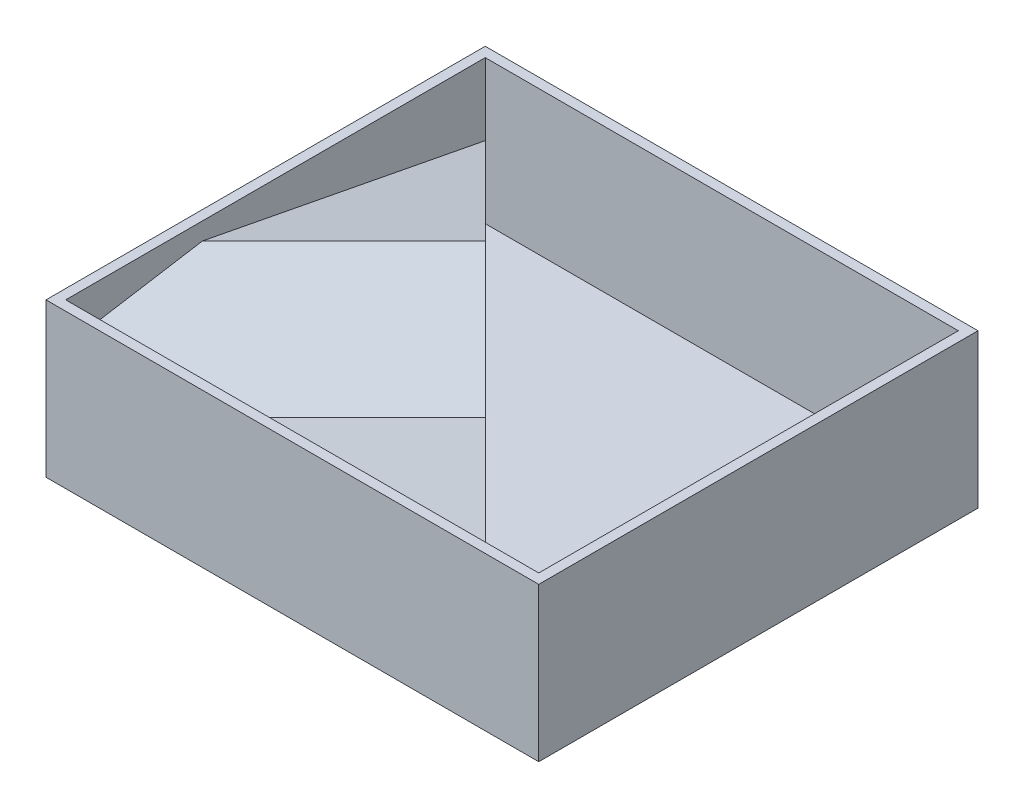
ISO-10303-21;
HEADER;
FILE_DESCRIPTION(('STEP AP214'),'2;1');
FILE_NAME('part.step','',(''),(''),'','','');
FILE_SCHEMA(('AUTOMOTIVE_DESIGN { 1 0 10303 214 1 1 1 1 }'));
ENDSEC;
DATA;
#1=APPLICATION_CONTEXT('core data for automotive mechanical design processes');
#2=APPLICATION_PROTOCOL_DEFINITION('international standard','automotive_design',2000,#1);
#3=PRODUCT_CONTEXT('',#1,'mechanical');
#4=PRODUCT('Part','Part','',(#3));
#5=PRODUCT_RELATED_PRODUCT_CATEGORY('part','',(#4));
#6=PRODUCT_DEFINITION_FORMATION('','',#4);
#7=PRODUCT_DEFINITION_CONTEXT('part definition',#1,'design');
#8=PRODUCT_DEFINITION('design','',#6,#7);
#9=PRODUCT_DEFINITION_SHAPE('','',#8);
#10=(LENGTH_UNIT() NAMED_UNIT(*) SI_UNIT(.MILLI.,.METRE.));
#11=(NAMED_UNIT(*) PLANE_ANGLE_UNIT() SI_UNIT($,.RADIAN.));
#12=(NAMED_UNIT(*) SI_UNIT($,.STERADIAN.) SOLID_ANGLE_UNIT());
#13=UNCERTAINTY_MEASURE_WITH_UNIT(LENGTH_MEASURE(1.E-05),#10,'distance_accuracy_value','');
#14=(GEOMETRIC_REPRESENTATION_CONTEXT(3) GLOBAL_UNCERTAINTY_ASSIGNED_CONTEXT((#13)) GLOBAL_UNIT_ASSIGNED_CONTEXT((#10,
#11,#12)) REPRESENTATION_CONTEXT('',''));
#15=CARTESIAN_POINT('',(0.,0.,0.));
#16=DIRECTION('',(0.,0.,1.));
#17=DIRECTION('',(1.,0.,0.));
#18=AXIS2_PLACEMENT_3D('',#15,#16,#17);
#19=CARTESIAN_POINT('',(-59.9378997860176,39.624,-63.9370439423789));
#20=DIRECTION('',(1.,0.,0.));
#21=DIRECTION('',(0.,0.,-1.));
#22=AXIS2_PLACEMENT_3D('',#19,#20,#21);
#23=PLANE('',#22);
#24=DIRECTION('',(0.,-1.,0.));
#25=VECTOR('',#24,1.);
#26=CARTESIAN_POINT('',(-59.9378997860176,39.624,-61.397043942379));
#27=LINE('',#26,#25);
#28=CARTESIAN_POINT('',(-59.9378997860176,18.4494482096416,-61.397043942379));
#29=VERTEX_POINT('',#28);
#30=CARTESIAN_POINT('',(-59.9378997860176,2.54,-61.397043942379));
#31=VERTEX_POINT('',#30);
#32=EDGE_CURVE('E212',#29,#31,#27,.T.);
#33=ORIENTED_EDGE('',*,*,#32,.F.);
#34=DIRECTION('',(0.,-0.189206076258095,-0.981937401623452));
#35=VECTOR('',#34,1.);
#36=CARTESIAN_POINT('',(-59.9378997860176,18.7355718555945,-59.9121259365388));
#37=LINE('',#36,#35);
#38=CARTESIAN_POINT('',(-59.9378997860176,32.514624018701,11.5980863434216));
#39=VERTEX_POINT('',#38);
#40=EDGE_CURVE('E11',#39,#29,#37,.T.);
#41=ORIENTED_EDGE('',*,*,#40,.F.);
#42=DIRECTION('',(0.,0.162584559288982,-0.986694613890644));
#43=VECTOR('',#42,1.);
#44=CARTESIAN_POINT('',(-59.9378997860176,44.8199958795938,-63.0808634299304));
#45=LINE('',#44,#43);
#46=CARTESIAN_POINT('',(-59.9378997860176,26.7132358306222,46.8056023787655));
#47=VERTEX_POINT('',#46);
#48=EDGE_CURVE('E188',#47,#39,#45,.T.);
#49=ORIENTED_EDGE('',*,*,#48,.F.);
#50=DIRECTION('',(0.,-1.,0.));
#51=VECTOR('',#50,1.);
#52=CARTESIAN_POINT('',(-59.9378997860176,39.624,46.8056023787655));
#53=LINE('',#52,#51);
#54=CARTESIAN_POINT('',(-59.9378997860176,2.54,46.8056023787655));
#55=VERTEX_POINT('',#54);
#56=EDGE_CURVE('E207',#47,#55,#53,.T.);
#57=ORIENTED_EDGE('',*,*,#56,.T.);
#58=DIRECTION('',(0.,0.,1.));
#59=VECTOR('',#58,1.);
#60=CARTESIAN_POINT('',(-59.9378997860176,2.54,-63.9370439423789));
#61=LINE('',#60,#59);
#62=EDGE_CURVE('E195',#31,#55,#61,.T.);
#63=ORIENTED_EDGE('',*,*,#62,.F.);
#64=EDGE_LOOP('',(#33,#41,#49,#57,#63));
#65=FACE_BOUND('',#64,.T.);
#66=ADVANCED_FACE('F43',(#65),#23,.T.);
#67=DIRECTION('',(0.,0.162584559288982,-0.986694613890644));
#68=VECTOR('',#67,1.);
#69=CARTESIAN_POINT('',(-59.9378997860176,47.3591083214804,-62.6624761482552));
#70=LINE('',#69,#68);
#71=CARTESIAN_POINT('',(-59.9378997860176,29.3212888655207,46.8056023787655));
#72=VERTEX_POINT('',#71);
#73=CARTESIAN_POINT('',(-59.9378997860176,35.134,11.5293695459866));
#74=VERTEX_POINT('',#73);
#75=EDGE_CURVE('E194',#72,#74,#70,.T.);
#76=ORIENTED_EDGE('',*,*,#75,.T.);
#77=DIRECTION('',(0.,-0.189206076258095,-0.981937401623452));
#78=VECTOR('',#77,1.);
#79=CARTESIAN_POINT('',(-59.9378997860176,21.2739437474469,-60.4012359194636));
#80=LINE('',#79,#78);
#81=CARTESIAN_POINT('',(-59.9378997860176,21.0820649897881,-61.397043942379));
#82=VERTEX_POINT('',#81);
#83=EDGE_CURVE('E156',#74,#82,#80,.T.);
#84=ORIENTED_EDGE('',*,*,#83,.T.);
#85=CARTESIAN_POINT('',(-59.9378997860176,39.624,-61.397043942379));
#86=VERTEX_POINT('',#85);
#87=EDGE_CURVE('E210',#86,#82,#27,.T.);
#88=ORIENTED_EDGE('',*,*,#87,.F.);
#89=DIRECTION('',(0.,0.,1.));
#90=VECTOR('',#89,1.);
#91=CARTESIAN_POINT('',(-59.9378997860176,39.624,-63.9370439423789));
#92=LINE('',#91,#90);
#93=CARTESIAN_POINT('',(-59.9378997860176,39.624,46.8056023787655));
#94=VERTEX_POINT('',#93);
#95=EDGE_CURVE('E224',#86,#94,#92,.T.);
#96=ORIENTED_EDGE('',*,*,#95,.T.);
#97=EDGE_CURVE('E204',#94,#72,#53,.T.);
#98=ORIENTED_EDGE('',*,*,#97,.T.);
#99=EDGE_LOOP('',(#76,#84,#88,#96,#98));
#100=FACE_BOUND('',#99,.T.);
#101=ADVANCED_FACE('F285',(#100),#23,.T.);
#102=CARTESIAN_POINT('',(-62.4778997860176,39.624,-63.9370439423789));
#103=DIRECTION('',(1.,0.,0.));
#104=DIRECTION('',(0.,0.,-1.));
#105=AXIS2_PLACEMENT_3D('',#102,#103,#104);
#106=PLANE('',#105);
#107=DIRECTION('',(0.,-1.,0.));
#108=VECTOR('',#107,1.);
#109=CARTESIAN_POINT('',(-62.4778997860176,39.624,-63.9370439423789));
#110=LINE('',#109,#108);
#111=CARTESIAN_POINT('',(-62.4778997860176,39.624,-63.9370439423789));
#112=VERTEX_POINT('',#111);
#113=CARTESIAN_POINT('',(-62.4778997860176,0.,-63.9370439423789));
#114=VERTEX_POINT('',#113);
#115=EDGE_CURVE('E239',#112,#114,#110,.T.);
#116=ORIENTED_EDGE('',*,*,#115,.T.);
#117=DIRECTION('',(0.,0.,1.));
#118=VECTOR('',#117,1.);
#119=CARTESIAN_POINT('',(-62.4778997860176,0.,-63.9370439423789));
#120=LINE('',#119,#118);
#121=CARTESIAN_POINT('',(-62.4778997860176,0.,49.3456023787655));
#122=VERTEX_POINT('',#121);
#123=EDGE_CURVE('E203',#114,#122,#120,.T.);
#124=ORIENTED_EDGE('',*,*,#123,.T.);
#125=DIRECTION('',(0.,-1.,0.));
#126=VECTOR('',#125,1.);
#127=CARTESIAN_POINT('',(-62.4778997860176,39.624,49.3456023787655));
#128=LINE('',#127,#126);
#129=CARTESIAN_POINT('',(-62.4778997860176,39.624,49.3456023787655));
#130=VERTEX_POINT('',#129);
#131=EDGE_CURVE('E257',#130,#122,#128,.T.);
#132=ORIENTED_EDGE('',*,*,#131,.F.);
#133=DIRECTION('',(0.,0.,1.));
#134=VECTOR('',#133,1.);
#135=CARTESIAN_POINT('',(-62.4778997860176,39.624,-63.9370439423789));
#136=LINE('',#135,#134);
#137=EDGE_CURVE('E229',#112,#130,#136,.T.);
#138=ORIENTED_EDGE('',*,*,#137,.F.);
#139=EDGE_LOOP('',(#116,#124,#132,#138));
#140=FACE_BOUND('',#139,.T.);
#141=ADVANCED_FACE('F44',(#140),#106,.F.);
#142=CARTESIAN_POINT('',(-62.4778997860176,39.624,49.3456023787655));
#143=DIRECTION('',(0.,0.,-1.));
#144=DIRECTION('',(-1.,0.,0.));
#145=AXIS2_PLACEMENT_3D('',#142,#143,#144);
#146=PLANE('',#145);
#147=ORIENTED_EDGE('',*,*,#131,.T.);
#148=DIRECTION('',(1.,0.,0.));
#149=VECTOR('',#148,1.);
#150=CARTESIAN_POINT('',(-62.4778997860176,0.,49.3456023787655));
#151=LINE('',#150,#149);
#152=CARTESIAN_POINT('',(64.6002912861796,0.,49.3456023787655));
#153=VERTEX_POINT('',#152);
#154=EDGE_CURVE('E243',#122,#153,#151,.T.);
#155=ORIENTED_EDGE('',*,*,#154,.T.);
#156=DIRECTION('',(0.,-1.,0.));
#157=VECTOR('',#156,1.);
#158=CARTESIAN_POINT('',(64.6002912861796,39.624,49.3456023787655));
#159=LINE('',#158,#157);
#160=CARTESIAN_POINT('',(64.6002912861796,39.624,49.3456023787655));
#161=VERTEX_POINT('',#160);
#162=EDGE_CURVE('E254',#161,#153,#159,.T.);
#163=ORIENTED_EDGE('',*,*,#162,.F.);
#164=DIRECTION('',(1.,0.,0.));
#165=VECTOR('',#164,1.);
#166=CARTESIAN_POINT('',(-62.4778997860176,39.624,49.3456023787655));
#167=LINE('',#166,#165);
#168=EDGE_CURVE('E231',#130,#161,#167,.T.);
#169=ORIENTED_EDGE('',*,*,#168,.F.);
#170=EDGE_LOOP('',(#147,#155,#163,#169));
#171=FACE_BOUND('',#170,.T.);
#172=ADVANCED_FACE('F335',(#171),#146,.F.);
#173=CARTESIAN_POINT('',(64.6002912861796,39.624,-63.9370439423789));
#174=DIRECTION('',(-1.,0.,0.));
#175=DIRECTION('',(0.,0.,1.));
#176=AXIS2_PLACEMENT_3D('',#173,#174,#175);
#177=PLANE('',#176);
#178=DIRECTION('',(0.,0.,-1.));
#179=VECTOR('',#178,1.);
#180=CARTESIAN_POINT('',(64.6002912861796,0.,-63.9370439423789));
#181=LINE('',#180,#179);
#182=CARTESIAN_POINT('',(64.6002912861796,0.,-63.9370439423789));
#183=VERTEX_POINT('',#182);
#184=EDGE_CURVE('E244',#153,#183,#181,.T.);
#185=ORIENTED_EDGE('',*,*,#184,.T.);
#186=DIRECTION('',(0.,-1.,0.));
#187=VECTOR('',#186,1.);
#188=CARTESIAN_POINT('',(64.6002912861796,39.624,-63.9370439423789));
#189=LINE('',#188,#187);
#190=CARTESIAN_POINT('',(64.6002912861796,39.624,-63.9370439423789));
#191=VERTEX_POINT('',#190);
#192=EDGE_CURVE('E249',#191,#183,#189,.T.);
#193=ORIENTED_EDGE('',*,*,#192,.F.);
#194=DIRECTION('',(0.,0.,-1.));
#195=VECTOR('',#194,1.);
#196=CARTESIAN_POINT('',(64.6002912861796,39.624,-63.9370439423789));
#197=LINE('',#196,#195);
#198=EDGE_CURVE('E236',#161,#191,#197,.T.);
#199=ORIENTED_EDGE('',*,*,#198,.F.);
#200=ORIENTED_EDGE('',*,*,#162,.T.);
#201=EDGE_LOOP('',(#185,#193,#199,#200));
#202=FACE_BOUND('',#201,.T.);
#203=ADVANCED_FACE('F330',(#202),#177,.F.);
#204=CARTESIAN_POINT('',(-62.4778997860176,39.624,-63.9370439423789));
#205=DIRECTION('',(0.,0.,1.));
#206=DIRECTION('',(1.,0.,0.));
#207=AXIS2_PLACEMENT_3D('',#204,#205,#206);
#208=PLANE('',#207);
#209=DIRECTION('',(-1.,0.,0.));
#210=VECTOR('',#209,1.);
#211=CARTESIAN_POINT('',(-62.4778997860176,0.,-63.9370439423789));
#212=LINE('',#211,#210);
#213=EDGE_CURVE('E234',#183,#114,#212,.T.);
#214=ORIENTED_EDGE('',*,*,#213,.T.);
#215=ORIENTED_EDGE('',*,*,#115,.F.);
#216=DIRECTION('',(-1.,0.,0.));
#217=VECTOR('',#216,1.);
#218=CARTESIAN_POINT('',(-62.4778997860176,39.624,-63.9370439423789));
#219=LINE('',#218,#217);
#220=EDGE_CURVE('E238',#191,#112,#219,.T.);
#221=ORIENTED_EDGE('',*,*,#220,.F.);
#222=ORIENTED_EDGE('',*,*,#192,.T.);
#223=EDGE_LOOP('',(#214,#215,#221,#222));
#224=FACE_BOUND('',#223,.T.);
#225=ADVANCED_FACE('F324',(#224),#208,.F.);
#226=CARTESIAN_POINT('',(0.,39.624,0.));
#227=DIRECTION('',(0.,1.,0.));
#228=DIRECTION('',(0.,0.,1.));
#229=AXIS2_PLACEMENT_3D('',#226,#227,#228);
#230=PLANE('',#229);
#231=ORIENTED_EDGE('',*,*,#95,.F.);
#232=DIRECTION('',(-1.,0.,0.));
#233=VECTOR('',#232,1.);
#234=CARTESIAN_POINT('',(-62.4778997860176,39.624,-61.397043942379));
#235=LINE('',#234,#233);
#236=CARTESIAN_POINT('',(62.0602912861796,39.624,-61.397043942379));
#237=VERTEX_POINT('',#236);
#238=EDGE_CURVE('E226',#237,#86,#235,.T.);
#239=ORIENTED_EDGE('',*,*,#238,.F.);
#240=DIRECTION('',(0.,0.,-1.));
#241=VECTOR('',#240,1.);
#242=CARTESIAN_POINT('',(62.0602912861796,39.624,-63.9370439423789));
#243=LINE('',#242,#241);
#244=CARTESIAN_POINT('',(62.0602912861796,39.624,46.8056023787655));
#245=VERTEX_POINT('',#244);
#246=EDGE_CURVE('E228',#245,#237,#243,.T.);
#247=ORIENTED_EDGE('',*,*,#246,.F.);
#248=DIRECTION('',(1.,0.,0.));
#249=VECTOR('',#248,1.);
#250=CARTESIAN_POINT('',(-62.4778997860176,39.624,46.8056023787655));
#251=LINE('',#250,#249);
#252=EDGE_CURVE('E221',#94,#245,#251,.T.);
#253=ORIENTED_EDGE('',*,*,#252,.F.);
#254=EDGE_LOOP('',(#231,#239,#247,#253));
#255=FACE_BOUND('',#254,.T.);
#256=ORIENTED_EDGE('',*,*,#137,.T.);
#257=ORIENTED_EDGE('',*,*,#168,.T.);
#258=ORIENTED_EDGE('',*,*,#198,.T.);
#259=ORIENTED_EDGE('',*,*,#220,.T.);
#260=EDGE_LOOP('',(#256,#257,#258,#259));
#261=FACE_BOUND('',#260,.T.);
#262=ADVANCED_FACE('F318',(#255,#261),#230,.T.);
#263=CARTESIAN_POINT('',(0.,0.,0.));
#264=DIRECTION('',(0.,1.,0.));
#265=DIRECTION('',(0.,0.,1.));
#266=AXIS2_PLACEMENT_3D('',#263,#264,#265);
#267=PLANE('',#266);
#268=ORIENTED_EDGE('',*,*,#123,.F.);
#269=ORIENTED_EDGE('',*,*,#213,.F.);
#270=ORIENTED_EDGE('',*,*,#184,.F.);
#271=ORIENTED_EDGE('',*,*,#154,.F.);
#272=EDGE_LOOP('',(#268,#269,#270,#271));
#273=FACE_BOUND('',#272,.T.);
#274=ADVANCED_FACE('F312',(#273),#267,.F.);
#275=CARTESIAN_POINT('',(-62.4778997860176,39.624,46.8056023787655));
#276=DIRECTION('',(0.,0.,-1.));
#277=DIRECTION('',(-1.,0.,0.));
#278=AXIS2_PLACEMENT_3D('',#275,#276,#277);
#279=PLANE('',#278);
#280=DIRECTION('',(-0.986694613890644,0.162584559288982,0.));
#281=VECTOR('',#280,1.);
#282=CARTESIAN_POINT('',(-64.4819197767879,27.4619857246614,46.8056023787655));
#283=LINE('',#282,#281);
#284=CARTESIAN_POINT('',(-36.0479803023914,22.776727030418,46.8056023787655));
#285=VERTEX_POINT('',#284);
#286=EDGE_CURVE('E51',#285,#47,#283,.T.);
#287=ORIENTED_EDGE('',*,*,#286,.F.);
#288=DIRECTION('',(-0.995309200473239,-0.0967450022136603,0.));
#289=VECTOR('',#288,1.);
#290=CARTESIAN_POINT('',(-60.6082824557617,20.3894422699975,46.8056023787655));
#291=LINE('',#290,#289);
#292=CARTESIAN_POINT('',(48.2647465351268,30.9720043780574,46.8056023787655));
#293=VERTEX_POINT('',#292);
#294=EDGE_CURVE('E171',#293,#285,#291,.T.);
#295=ORIENTED_EDGE('',*,*,#294,.F.);
#296=DIRECTION('',(0.,-1.,0.));
#297=VECTOR('',#296,1.);
#298=CARTESIAN_POINT('',(48.2647465351269,39.624,46.8056023787655));
#299=LINE('',#298,#297);
#300=CARTESIAN_POINT('',(48.2647465351268,33.5358900537595,46.8056023787655));
#301=VERTEX_POINT('',#300);
#302=EDGE_CURVE('E168',#301,#293,#299,.T.);
#303=ORIENTED_EDGE('',*,*,#302,.F.);
#304=DIRECTION('',(-0.995309200473239,-0.0967450022136603,0.));
#305=VECTOR('',#304,1.);
#306=CARTESIAN_POINT('',(-60.855162060558,22.9293310129866,46.8056023787655));
#307=LINE('',#306,#305);
#308=CARTESIAN_POINT('',(-35.879388395871,25.357,46.8056023787655));
#309=VERTEX_POINT('',#308);
#310=EDGE_CURVE('E259',#301,#309,#307,.T.);
#311=ORIENTED_EDGE('',*,*,#310,.T.);
#312=DIRECTION('',(-0.986694613890644,0.162584559288982,0.));
#313=VECTOR('',#312,1.);
#314=CARTESIAN_POINT('',(-64.0635324951127,30.0010981665481,46.8056023787655));
#315=LINE('',#314,#313);
#316=EDGE_CURVE('E261',#309,#72,#315,.T.);
#317=ORIENTED_EDGE('',*,*,#316,.T.);
#318=ORIENTED_EDGE('',*,*,#97,.F.);
#319=ORIENTED_EDGE('',*,*,#252,.T.);
#320=DIRECTION('',(0.,-1.,0.));
#321=VECTOR('',#320,1.);
#322=CARTESIAN_POINT('',(62.0602912861796,39.624,46.8056023787655));
#323=LINE('',#322,#321);
#324=CARTESIAN_POINT('',(62.0602912861796,2.54,46.8056023787655));
#325=VERTEX_POINT('',#324);
#326=EDGE_CURVE('E211',#245,#325,#323,.T.);
#327=ORIENTED_EDGE('',*,*,#326,.T.);
#328=DIRECTION('',(1.,0.,0.));
#329=VECTOR('',#328,1.);
#330=CARTESIAN_POINT('',(-62.4778997860176,2.54,46.8056023787655));
#331=LINE('',#330,#329);
#332=EDGE_CURVE('E202',#55,#325,#331,.T.);
#333=ORIENTED_EDGE('',*,*,#332,.F.);
#334=ORIENTED_EDGE('',*,*,#56,.F.);
#335=EDGE_LOOP('',(#287,#295,#303,#311,#317,#318,#319,#327,#333,#334));
#336=FACE_BOUND('',#335,.T.);
#337=ADVANCED_FACE('F272',(#336),#279,.T.);
#338=CARTESIAN_POINT('',(62.0602912861796,39.624,-63.9370439423789));
#339=DIRECTION('',(-1.,0.,0.));
#340=DIRECTION('',(0.,0.,1.));
#341=AXIS2_PLACEMENT_3D('',#338,#339,#340);
#342=PLANE('',#341);
#343=DIRECTION('',(0.,0.,-1.));
#344=VECTOR('',#343,1.);
#345=CARTESIAN_POINT('',(62.0602912861796,2.54,-63.9370439423789));
#346=LINE('',#345,#344);
#347=CARTESIAN_POINT('',(62.0602912861796,2.54,-61.397043942379));
#348=VERTEX_POINT('',#347);
#349=EDGE_CURVE('E214',#325,#348,#346,.T.);
#350=ORIENTED_EDGE('',*,*,#349,.F.);
#351=ORIENTED_EDGE('',*,*,#326,.F.);
#352=ORIENTED_EDGE('',*,*,#246,.T.);
#353=DIRECTION('',(0.,-1.,0.));
#354=VECTOR('',#353,1.);
#355=CARTESIAN_POINT('',(62.0602912861796,39.624,-61.397043942379));
#356=LINE('',#355,#354);
#357=EDGE_CURVE('E61',#237,#348,#356,.T.);
#358=ORIENTED_EDGE('',*,*,#357,.T.);
#359=EDGE_LOOP('',(#350,#351,#352,#358));
#360=FACE_BOUND('',#359,.T.);
#361=ADVANCED_FACE('F315',(#360),#342,.T.);
#362=CARTESIAN_POINT('',(-62.4778997860176,39.624,-61.397043942379));
#363=DIRECTION('',(0.,0.,1.));
#364=DIRECTION('',(1.,0.,0.));
#365=AXIS2_PLACEMENT_3D('',#362,#363,#364);
#366=PLANE('',#365);
#367=DIRECTION('',(-1.,0.,0.));
#368=VECTOR('',#367,1.);
#369=CARTESIAN_POINT('',(-62.4778997860176,2.54,-61.397043942379));
#370=LINE('',#369,#368);
#371=EDGE_CURVE('E219',#348,#31,#370,.T.);
#372=ORIENTED_EDGE('',*,*,#371,.F.);
#373=ORIENTED_EDGE('',*,*,#357,.F.);
#374=ORIENTED_EDGE('',*,*,#238,.T.);
#375=ORIENTED_EDGE('',*,*,#87,.T.);
#376=EDGE_CURVE('E208',#82,#29,#27,.T.);
#377=ORIENTED_EDGE('',*,*,#376,.T.);
#378=ORIENTED_EDGE('',*,*,#32,.T.);
#379=EDGE_LOOP('',(#372,#373,#374,#375,#377,#378));
#380=FACE_BOUND('',#379,.T.);
#381=ADVANCED_FACE('F280',(#380),#366,.T.);
#382=CARTESIAN_POINT('',(0.,2.54,0.));
#383=DIRECTION('',(0.,1.,0.));
#384=DIRECTION('',(0.,0.,1.));
#385=AXIS2_PLACEMENT_3D('',#382,#383,#384);
#386=PLANE('',#385);
#387=ORIENTED_EDGE('',*,*,#62,.T.);
#388=ORIENTED_EDGE('',*,*,#332,.T.);
#389=ORIENTED_EDGE('',*,*,#349,.T.);
#390=ORIENTED_EDGE('',*,*,#371,.T.);
#391=EDGE_LOOP('',(#387,#388,#389,#390));
#392=FACE_BOUND('',#391,.T.);
#393=ADVANCED_FACE('F273',(#392),#386,.T.);
#394=CARTESIAN_POINT('',(79.5818776754174,39.624,78.122733519056));
#395=DIRECTION('',(0.707106781186547,0.,-0.707106781186548));
#396=DIRECTION('',(0.700519231896705,0.136182273022966,0.700519231896705));
#397=AXIS2_PLACEMENT_3D('',#394,#395,#396);
#398=PLANE('',#397);
#399=DIRECTION('',(0.700519231896705,0.136182273022966,0.700519231896705));
#400=VECTOR('',#399,1.);
#401=CARTESIAN_POINT('',(6.19267906962794,25.357,4.73353491326659));
#402=LINE('',#401,#400);
#403=CARTESIAN_POINT('',(6.19267906962794,25.357,4.73353491326659));
#404=VERTEX_POINT('',#403);
#405=EDGE_CURVE('E182',#404,#301,#402,.T.);
#406=ORIENTED_EDGE('',*,*,#405,.T.);
#407=ORIENTED_EDGE('',*,*,#302,.T.);
#408=DIRECTION('',(0.700519231896705,0.136182273022966,0.700519231896705));
#409=VECTOR('',#408,1.);
#410=CARTESIAN_POINT('',(6.43726940780707,22.8406631519332,4.97812525144571));
#411=LINE('',#410,#409);
#412=CARTESIAN_POINT('',(6.10838311636773,22.776727030418,4.64923896000637));
#413=VERTEX_POINT('',#412);
#414=EDGE_CURVE('E162',#413,#293,#411,.T.);
#415=ORIENTED_EDGE('',*,*,#414,.F.);
#416=DIRECTION('',(0.688655943794372,-0.226949294234123,0.688655943794372));
#417=VECTOR('',#416,1.);
#418=CARTESIAN_POINT('',(-23.8823055995785,32.660277298172,-25.3414497559399));
#419=LINE('',#418,#417);
#420=CARTESIAN_POINT('',(-23.4403346431173,32.514624018701,-24.8994787994787));
#421=VERTEX_POINT('',#420);
#422=EDGE_CURVE('E151',#421,#413,#419,.T.);
#423=ORIENTED_EDGE('',*,*,#422,.F.);
#424=DIRECTION('',(-0.682230409590376,-0.262913172854267,-0.682230409590375));
#425=VECTOR('',#424,1.);
#426=CARTESIAN_POINT('',(-59.4658629013147,18.6313584753186,-60.925007057676));
#427=LINE('',#426,#425);
#428=EDGE_CURVE('E175',#421,#29,#427,.T.);
#429=ORIENTED_EDGE('',*,*,#428,.T.);
#430=ORIENTED_EDGE('',*,*,#376,.F.);
#431=DIRECTION('',(0.682230409590376,0.262913172854267,0.682230409590375));
#432=VECTOR('',#431,1.);
#433=CARTESIAN_POINT('',(-59.9380684272816,21.082,-61.3972125836429));
#434=LINE('',#433,#432);
#435=CARTESIAN_POINT('',(-23.4746930418348,35.134,-24.9338371981962));
#436=VERTEX_POINT('',#435);
#437=EDGE_CURVE('E172',#82,#436,#434,.T.);
#438=ORIENTED_EDGE('',*,*,#437,.T.);
#439=DIRECTION('',(0.688655943794372,-0.226949294234123,0.688655943794372));
#440=VECTOR('',#439,1.);
#441=CARTESIAN_POINT('',(-23.4746930418348,35.134,-24.9338371981962));
#442=LINE('',#441,#440);
#443=EDGE_CURVE('E177',#436,#404,#442,.T.);
#444=ORIENTED_EDGE('',*,*,#443,.T.);
#445=EDGE_LOOP('',(#406,#407,#415,#423,#429,#430,#438,#444));
#446=FACE_BOUND('',#445,.T.);
#447=ADVANCED_FACE('F165',(#446),#398,.T.);
#448=CARTESIAN_POINT('',(-59.4658629013147,18.6313584753186,-60.925007057676));
#449=DIRECTION('',(-0.185907687388523,0.96481949790606,-0.185907687388523));
#450=DIRECTION('',(-0.981937401623452,-0.189206076258095,0.));
#451=AXIS2_PLACEMENT_3D('',#448,#449,#450);
#452=PLANE('',#451);
#453=ORIENTED_EDGE('',*,*,#40,.T.);
#454=ORIENTED_EDGE('',*,*,#428,.F.);
#455=DIRECTION('',(-0.707106781186547,0.,0.707106781186548));
#456=VECTOR('',#455,1.);
#457=CARTESIAN_POINT('',(-23.4403346431173,32.514624018701,-24.8994787994787));
#458=LINE('',#457,#456);
#459=EDGE_CURVE('E159',#421,#39,#458,.T.);
#460=ORIENTED_EDGE('',*,*,#459,.T.);
#461=EDGE_LOOP('',(#453,#454,#460));
#462=FACE_BOUND('',#461,.T.);
#463=ADVANCED_FACE('F380',(#462),#452,.F.);
#464=CARTESIAN_POINT('',(-23.8823055995785,32.660277298172,-25.3414497559399));
#465=DIRECTION('',(-0.160477384938449,-0.973906575522844,-0.160477384938449));
#466=DIRECTION('',(0.986694613890644,-0.162584559288982,0.));
#467=AXIS2_PLACEMENT_3D('',#464,#465,#466);
#468=PLANE('',#467);
#469=ORIENTED_EDGE('',*,*,#286,.T.);
#470=ORIENTED_EDGE('',*,*,#48,.T.);
#471=ORIENTED_EDGE('',*,*,#459,.F.);
#472=ORIENTED_EDGE('',*,*,#422,.T.);
#473=DIRECTION('',(-0.707106781186547,0.,0.707106781186548));
#474=VECTOR('',#473,1.);
#475=CARTESIAN_POINT('',(6.10838311636773,22.776727030418,4.64923896000637));
#476=LINE('',#475,#474);
#477=EDGE_CURVE('E155',#413,#285,#476,.T.);
#478=ORIENTED_EDGE('',*,*,#477,.T.);
#479=EDGE_LOOP('',(#469,#470,#471,#472,#478));
#480=FACE_BOUND('',#479,.T.);
#481=ADVANCED_FACE('F154',(#480),#468,.T.);
#482=CARTESIAN_POINT('',(6.43726940780707,22.8406631519332,4.97812525144571));
#483=DIRECTION('',(0.0962954087319371,-0.990683798451503,0.0962954087319371));
#484=DIRECTION('',(0.995309200473239,0.0967450022136603,0.));
#485=AXIS2_PLACEMENT_3D('',#482,#483,#484);
#486=PLANE('',#485);
#487=ORIENTED_EDGE('',*,*,#414,.T.);
#488=ORIENTED_EDGE('',*,*,#294,.T.);
#489=ORIENTED_EDGE('',*,*,#477,.F.);
#490=EDGE_LOOP('',(#487,#488,#489));
#491=FACE_BOUND('',#490,.T.);
#492=ADVANCED_FACE('F167',(#491),#486,.T.);
#493=CARTESIAN_POINT('',(-59.9380684272816,21.082,-61.3972125836429));
#494=DIRECTION('',(0.185907687388523,-0.96481949790606,0.185907687388523));
#495=DIRECTION('',(0.981937401623452,0.189206076258095,0.));
#496=AXIS2_PLACEMENT_3D('',#493,#494,#495);
#497=PLANE('',#496);
#498=ORIENTED_EDGE('',*,*,#83,.F.);
#499=DIRECTION('',(-0.707106781186547,0.,0.707106781186548));
#500=VECTOR('',#499,1.);
#501=CARTESIAN_POINT('',(-23.4746930418348,35.134,-24.9338371981962));
#502=LINE('',#501,#500);
#503=EDGE_CURVE('E185',#436,#74,#502,.T.);
#504=ORIENTED_EDGE('',*,*,#503,.F.);
#505=ORIENTED_EDGE('',*,*,#437,.F.);
#506=EDGE_LOOP('',(#498,#504,#505));
#507=FACE_BOUND('',#506,.T.);
#508=ADVANCED_FACE('F282',(#507),#497,.F.);
#509=CARTESIAN_POINT('',(-23.4746930418348,35.134,-24.9338371981962));
#510=DIRECTION('',(-0.160477384938449,-0.973906575522844,-0.160477384938449));
#511=DIRECTION('',(0.986694613890644,-0.162584559288982,0.));
#512=AXIS2_PLACEMENT_3D('',#509,#510,#511);
#513=PLANE('',#512);
#514=ORIENTED_EDGE('',*,*,#75,.F.);
#515=ORIENTED_EDGE('',*,*,#316,.F.);
#516=DIRECTION('',(-0.707106781186547,0.,0.707106781186548));
#517=VECTOR('',#516,1.);
#518=CARTESIAN_POINT('',(6.19267906962794,25.357,4.73353491326659));
#519=LINE('',#518,#517);
#520=EDGE_CURVE('E184',#404,#309,#519,.T.);
#521=ORIENTED_EDGE('',*,*,#520,.F.);
#522=ORIENTED_EDGE('',*,*,#443,.F.);
#523=ORIENTED_EDGE('',*,*,#503,.T.);
#524=EDGE_LOOP('',(#514,#515,#521,#522,#523));
#525=FACE_BOUND('',#524,.T.);
#526=ADVANCED_FACE('F286',(#525),#513,.F.);
#527=CARTESIAN_POINT('',(6.19267906962794,25.357,4.73353491326659));
#528=DIRECTION('',(0.0962954087319371,-0.990683798451503,0.0962954087319371));
#529=DIRECTION('',(0.995309200473239,0.0967450022136603,0.));
#530=AXIS2_PLACEMENT_3D('',#527,#528,#529);
#531=PLANE('',#530);
#532=ORIENTED_EDGE('',*,*,#310,.F.);
#533=ORIENTED_EDGE('',*,*,#405,.F.);
#534=ORIENTED_EDGE('',*,*,#520,.T.);
#535=EDGE_LOOP('',(#532,#533,#534));
#536=FACE_BOUND('',#535,.T.);
#537=ADVANCED_FACE('F291',(#536),#531,.F.);
#538=CLOSED_SHELL('',(#66,#101,#141,#172,#203,#225,#262,#274,#337,#361,#381,#393,#447,#463,#481,
#492,#508,#526,#537));
#539=MANIFOLD_SOLID_BREP('B2',#538);
#540=ADVANCED_BREP_SHAPE_REPRESENTATION('',(#18,#539),#14);
#541=SHAPE_DEFINITION_REPRESENTATION(#9,#540);
ENDSEC;
END-ISO-10303-21;
